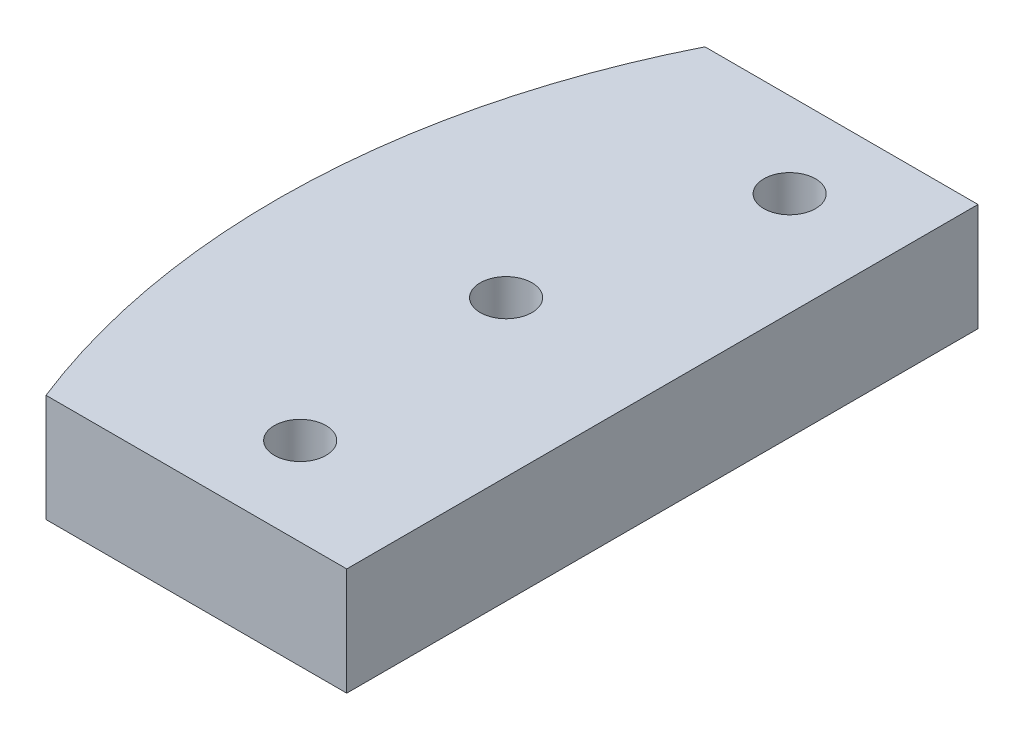
ISO-10303-21;
HEADER;
FILE_DESCRIPTION(('STEP AP214'),'2;1');
FILE_NAME('part.step','',(''),(''),'','','');
FILE_SCHEMA(('AUTOMOTIVE_DESIGN { 1 0 10303 214 1 1 1 1 }'));
ENDSEC;
DATA;
#1=APPLICATION_CONTEXT('core data for automotive mechanical design processes');
#2=APPLICATION_PROTOCOL_DEFINITION('international standard','automotive_design',2000,#1);
#3=PRODUCT_CONTEXT('',#1,'mechanical');
#4=PRODUCT('Part','Part','',(#3));
#5=PRODUCT_RELATED_PRODUCT_CATEGORY('part','',(#4));
#6=PRODUCT_DEFINITION_FORMATION('','',#4);
#7=PRODUCT_DEFINITION_CONTEXT('part definition',#1,'design');
#8=PRODUCT_DEFINITION('design','',#6,#7);
#9=PRODUCT_DEFINITION_SHAPE('','',#8);
#10=(LENGTH_UNIT() NAMED_UNIT(*) SI_UNIT(.MILLI.,.METRE.));
#11=(NAMED_UNIT(*) PLANE_ANGLE_UNIT() SI_UNIT($,.RADIAN.));
#12=(NAMED_UNIT(*) SI_UNIT($,.STERADIAN.) SOLID_ANGLE_UNIT());
#13=UNCERTAINTY_MEASURE_WITH_UNIT(LENGTH_MEASURE(1.E-05),#10,'distance_accuracy_value','');
#14=(GEOMETRIC_REPRESENTATION_CONTEXT(3) GLOBAL_UNCERTAINTY_ASSIGNED_CONTEXT((#13)) GLOBAL_UNIT_ASSIGNED_CONTEXT((#10,
#11,#12)) REPRESENTATION_CONTEXT('',''));
#15=CARTESIAN_POINT('',(0.,0.,0.));
#16=DIRECTION('',(0.,0.,1.));
#17=DIRECTION('',(1.,0.,0.));
#18=AXIS2_PLACEMENT_3D('',#15,#16,#17);
#19=CARTESIAN_POINT('',(-40.2,15.,12.811117837277));
#20=DIRECTION('',(0.,1.,0.));
#21=DIRECTION('',(-1.,0.,0.));
#22=AXIS2_PLACEMENT_3D('',#19,#20,#21);
#23=PLANE('',#22);
#24=CARTESIAN_POINT('',(-78.2,15.,0.100000000000003));
#25=DIRECTION('',(0.,1.,0.));
#26=DIRECTION('',(-1.,0.,0.));
#27=AXIS2_PLACEMENT_3D('',#24,#25,#26);
#28=CIRCLE('',#27,2.49999999999999);
#29=CARTESIAN_POINT('',(-80.7,15.,0.100000000000003));
#30=VERTEX_POINT('',#29);
#31=EDGE_CURVE('E104',#30,#30,#28,.F.);
#32=ORIENTED_EDGE('',*,*,#31,.F.);
#33=EDGE_LOOP('',(#32));
#34=FACE_BOUND('',#33,.T.);
#35=DIRECTION('',(0.,0.,1.));
#36=VECTOR('',#35,1.);
#37=CARTESIAN_POINT('',(-63.2,15.,-33.5));
#38=LINE('',#37,#36);
#39=CARTESIAN_POINT('',(-63.2,15.,-30.5));
#40=VERTEX_POINT('',#39);
#41=CARTESIAN_POINT('',(-63.2,15.,30.5));
#42=VERTEX_POINT('',#41);
#43=EDGE_CURVE('E12',#40,#42,#38,.T.);
#44=ORIENTED_EDGE('',*,*,#43,.T.);
#45=DIRECTION('',(1.,0.,0.));
#46=VECTOR('',#45,1.);
#47=CARTESIAN_POINT('',(0.,15.,30.5));
#48=LINE('',#47,#46);
#49=CARTESIAN_POINT('',(-92.2616921937509,15.,30.5));
#50=VERTEX_POINT('',#49);
#51=EDGE_CURVE('E55',#50,#42,#48,.T.);
#52=ORIENTED_EDGE('',*,*,#51,.F.);
#53=CARTESIAN_POINT('',(-22.6589151875398,15.,2.99288439458776));
#54=DIRECTION('',(0.,1.,0.));
#55=DIRECTION('',(-1.,0.,0.));
#56=AXIS2_PLACEMENT_3D('',#53,#54,#55);
#57=CIRCLE('',#56,74.8410848124602);
#58=CARTESIAN_POINT('',(-89.5873446539231,15.,-30.5));
#59=VERTEX_POINT('',#58);
#60=EDGE_CURVE('E110',#50,#59,#57,.F.);
#61=ORIENTED_EDGE('',*,*,#60,.T.);
#62=DIRECTION('',(1.,0.,0.));
#63=VECTOR('',#62,1.);
#64=CARTESIAN_POINT('',(0.,15.,-30.5));
#65=LINE('',#64,#63);
#66=EDGE_CURVE('E47',#59,#40,#65,.T.);
#67=ORIENTED_EDGE('',*,*,#66,.T.);
#68=EDGE_LOOP('',(#44,#52,#61,#67));
#69=FACE_BOUND('',#68,.T.);
#70=CARTESIAN_POINT('',(-73.2,15.,-22.3));
#71=DIRECTION('',(0.,1.,0.));
#72=DIRECTION('',(-1.,0.,0.));
#73=AXIS2_PLACEMENT_3D('',#70,#71,#72);
#74=CIRCLE('',#73,2.50000000000001);
#75=CARTESIAN_POINT('',(-75.7,15.,-22.3));
#76=VERTEX_POINT('',#75);
#77=EDGE_CURVE('E101',#76,#76,#74,.F.);
#78=ORIENTED_EDGE('',*,*,#77,.F.);
#79=EDGE_LOOP('',(#78));
#80=FACE_BOUND('',#79,.T.);
#81=CARTESIAN_POINT('',(-76.2,15.,22.));
#82=DIRECTION('',(0.,1.,0.));
#83=DIRECTION('',(-1.,0.,0.));
#84=AXIS2_PLACEMENT_3D('',#81,#82,#83);
#85=CIRCLE('',#84,2.50000000000001);
#86=CARTESIAN_POINT('',(-78.7,15.,22.));
#87=VERTEX_POINT('',#86);
#88=EDGE_CURVE('E42',#87,#87,#85,.F.);
#89=ORIENTED_EDGE('',*,*,#88,.F.);
#90=EDGE_LOOP('',(#89));
#91=FACE_BOUND('',#90,.T.);
#92=ADVANCED_FACE('F39',(#34,#69,#80,#91),#23,.F.);
#93=CARTESIAN_POINT('',(-63.2,0.,-33.5));
#94=DIRECTION('',(-1.,0.,0.));
#95=DIRECTION('',(0.,-1.,0.));
#96=AXIS2_PLACEMENT_3D('',#93,#94,#95);
#97=PLANE('',#96);
#98=DIRECTION('',(0.,-1.,0.));
#99=VECTOR('',#98,1.);
#100=CARTESIAN_POINT('',(-63.2,0.,-30.5));
#101=LINE('',#100,#99);
#102=CARTESIAN_POINT('',(-63.2,25.4,-30.5));
#103=VERTEX_POINT('',#102);
#104=EDGE_CURVE('E106',#103,#40,#101,.T.);
#105=ORIENTED_EDGE('',*,*,#104,.F.);
#106=DIRECTION('',(0.,0.,1.));
#107=VECTOR('',#106,1.);
#108=CARTESIAN_POINT('',(-63.2,25.4,-33.5));
#109=LINE('',#108,#107);
#110=CARTESIAN_POINT('',(-63.2,25.4,30.5));
#111=VERTEX_POINT('',#110);
#112=EDGE_CURVE('E96',#103,#111,#109,.T.);
#113=ORIENTED_EDGE('',*,*,#112,.T.);
#114=DIRECTION('',(0.,-1.,0.));
#115=VECTOR('',#114,1.);
#116=CARTESIAN_POINT('',(-63.2,0.,30.5));
#117=LINE('',#116,#115);
#118=EDGE_CURVE('E87',#111,#42,#117,.T.);
#119=ORIENTED_EDGE('',*,*,#118,.T.);
#120=ORIENTED_EDGE('',*,*,#43,.F.);
#121=EDGE_LOOP('',(#105,#113,#119,#120));
#122=FACE_BOUND('',#121,.T.);
#123=ADVANCED_FACE('F122',(#122),#97,.F.);
#124=CARTESIAN_POINT('',(0.,25.4,0.));
#125=DIRECTION('',(0.,-1.,0.));
#126=DIRECTION('',(0.,0.,-1.));
#127=AXIS2_PLACEMENT_3D('',#124,#125,#126);
#128=PLANE('',#127);
#129=CARTESIAN_POINT('',(-73.2,25.4,-22.3));
#130=DIRECTION('',(0.,-1.,0.));
#131=DIRECTION('',(0.,0.,-1.));
#132=AXIS2_PLACEMENT_3D('',#129,#130,#131);
#133=CIRCLE('',#132,2.50000000000001);
#134=CARTESIAN_POINT('',(-73.2,25.4,-24.8));
#135=VERTEX_POINT('',#134);
#136=EDGE_CURVE('E154',#135,#135,#133,.T.);
#137=ORIENTED_EDGE('',*,*,#136,.T.);
#138=EDGE_LOOP('',(#137));
#139=FACE_BOUND('',#138,.T.);
#140=CARTESIAN_POINT('',(-78.2,25.4,0.100000000000003));
#141=DIRECTION('',(0.,-1.,0.));
#142=DIRECTION('',(0.,0.,-1.));
#143=AXIS2_PLACEMENT_3D('',#140,#141,#142);
#144=CIRCLE('',#143,2.49999999999999);
#145=CARTESIAN_POINT('',(-78.2,25.4,-2.39999999999999));
#146=VERTEX_POINT('',#145);
#147=EDGE_CURVE('E158',#146,#146,#144,.T.);
#148=ORIENTED_EDGE('',*,*,#147,.T.);
#149=EDGE_LOOP('',(#148));
#150=FACE_BOUND('',#149,.T.);
#151=CARTESIAN_POINT('',(-76.2,25.4,22.));
#152=DIRECTION('',(0.,-1.,0.));
#153=DIRECTION('',(0.,0.,-1.));
#154=AXIS2_PLACEMENT_3D('',#151,#152,#153);
#155=CIRCLE('',#154,2.50000000000001);
#156=CARTESIAN_POINT('',(-76.2,25.4,19.5));
#157=VERTEX_POINT('',#156);
#158=EDGE_CURVE('E161',#157,#157,#155,.T.);
#159=ORIENTED_EDGE('',*,*,#158,.T.);
#160=EDGE_LOOP('',(#159));
#161=FACE_BOUND('',#160,.T.);
#162=DIRECTION('',(-1.,0.,0.));
#163=VECTOR('',#162,1.);
#164=CARTESIAN_POINT('',(0.,25.4,-30.5));
#165=LINE('',#164,#163);
#166=CARTESIAN_POINT('',(-89.5873446539231,25.4,-30.5));
#167=VERTEX_POINT('',#166);
#168=EDGE_CURVE('E83',#103,#167,#165,.T.);
#169=ORIENTED_EDGE('',*,*,#168,.T.);
#170=CARTESIAN_POINT('',(-22.6589151875398,25.4,2.99288439458776));
#171=DIRECTION('',(0.,-1.,0.));
#172=DIRECTION('',(0.,0.,-1.));
#173=AXIS2_PLACEMENT_3D('',#170,#171,#172);
#174=CIRCLE('',#173,74.8410848124602);
#175=CARTESIAN_POINT('',(-92.2616921937509,25.4,30.5));
#176=VERTEX_POINT('',#175);
#177=EDGE_CURVE('E94',#176,#167,#174,.T.);
#178=ORIENTED_EDGE('',*,*,#177,.F.);
#179=DIRECTION('',(-1.,0.,0.));
#180=VECTOR('',#179,1.);
#181=CARTESIAN_POINT('',(0.,25.4,30.5));
#182=LINE('',#181,#180);
#183=EDGE_CURVE('E162',#111,#176,#182,.T.);
#184=ORIENTED_EDGE('',*,*,#183,.F.);
#185=ORIENTED_EDGE('',*,*,#112,.F.);
#186=EDGE_LOOP('',(#169,#178,#184,#185));
#187=FACE_BOUND('',#186,.T.);
#188=ADVANCED_FACE('F92',(#139,#150,#161,#187),#128,.F.);
#189=CARTESIAN_POINT('',(-73.2,25.4,-22.3));
#190=DIRECTION('',(0.,-1.,0.));
#191=DIRECTION('',(0.,0.,-1.));
#192=AXIS2_PLACEMENT_3D('',#189,#190,#191);
#193=CYLINDRICAL_SURFACE('',#192,2.50000000000001);
#194=ORIENTED_EDGE('',*,*,#77,.T.);
#195=EDGE_LOOP('',(#194));
#196=FACE_BOUND('',#195,.T.);
#197=ORIENTED_EDGE('',*,*,#136,.F.);
#198=EDGE_LOOP('',(#197));
#199=FACE_BOUND('',#198,.T.);
#200=ADVANCED_FACE('F141',(#196,#199),#193,.F.);
#201=CARTESIAN_POINT('',(-78.2,25.4,0.100000000000003));
#202=DIRECTION('',(0.,-1.,0.));
#203=DIRECTION('',(0.,0.,-1.));
#204=AXIS2_PLACEMENT_3D('',#201,#202,#203);
#205=CYLINDRICAL_SURFACE('',#204,2.49999999999999);
#206=ORIENTED_EDGE('',*,*,#31,.T.);
#207=EDGE_LOOP('',(#206));
#208=FACE_BOUND('',#207,.T.);
#209=ORIENTED_EDGE('',*,*,#147,.F.);
#210=EDGE_LOOP('',(#209));
#211=FACE_BOUND('',#210,.T.);
#212=ADVANCED_FACE('F149',(#208,#211),#205,.F.);
#213=CARTESIAN_POINT('',(-76.2,25.4,22.));
#214=DIRECTION('',(0.,-1.,0.));
#215=DIRECTION('',(0.,0.,-1.));
#216=AXIS2_PLACEMENT_3D('',#213,#214,#215);
#217=CYLINDRICAL_SURFACE('',#216,2.50000000000001);
#218=ORIENTED_EDGE('',*,*,#88,.T.);
#219=EDGE_LOOP('',(#218));
#220=FACE_BOUND('',#219,.T.);
#221=ORIENTED_EDGE('',*,*,#158,.F.);
#222=EDGE_LOOP('',(#221));
#223=FACE_BOUND('',#222,.T.);
#224=ADVANCED_FACE('F118',(#220,#223),#217,.F.);
#225=CARTESIAN_POINT('',(-22.6589151875398,25.4,2.99288439458776));
#226=DIRECTION('',(0.,-1.,0.));
#227=DIRECTION('',(0.,0.,-1.));
#228=AXIS2_PLACEMENT_3D('',#225,#226,#227);
#229=CYLINDRICAL_SURFACE('',#228,74.8410848124602);
#230=ORIENTED_EDGE('',*,*,#60,.F.);
#231=DIRECTION('',(0.,1.,0.));
#232=VECTOR('',#231,1.);
#233=CARTESIAN_POINT('',(-92.2616921937509,12.4,30.5));
#234=LINE('',#233,#232);
#235=EDGE_CURVE('E97',#50,#176,#234,.T.);
#236=ORIENTED_EDGE('',*,*,#235,.T.);
#237=ORIENTED_EDGE('',*,*,#177,.T.);
#238=DIRECTION('',(0.,1.,0.));
#239=VECTOR('',#238,1.);
#240=CARTESIAN_POINT('',(-89.5873446539231,12.4,-30.5));
#241=LINE('',#240,#239);
#242=EDGE_CURVE('E79',#59,#167,#241,.T.);
#243=ORIENTED_EDGE('',*,*,#242,.F.);
#244=EDGE_LOOP('',(#230,#236,#237,#243));
#245=FACE_BOUND('',#244,.T.);
#246=ADVANCED_FACE('F99',(#245),#229,.T.);
#247=CARTESIAN_POINT('',(0.,12.4,-30.5));
#248=DIRECTION('',(0.,0.,-1.));
#249=DIRECTION('',(-1.,0.,0.));
#250=AXIS2_PLACEMENT_3D('',#247,#248,#249);
#251=PLANE('',#250);
#252=ORIENTED_EDGE('',*,*,#66,.F.);
#253=ORIENTED_EDGE('',*,*,#242,.T.);
#254=ORIENTED_EDGE('',*,*,#168,.F.);
#255=ORIENTED_EDGE('',*,*,#104,.T.);
#256=EDGE_LOOP('',(#252,#253,#254,#255));
#257=FACE_BOUND('',#256,.T.);
#258=ADVANCED_FACE('F81',(#257),#251,.T.);
#259=CARTESIAN_POINT('',(0.,12.4,30.5));
#260=DIRECTION('',(0.,0.,-1.));
#261=DIRECTION('',(-1.,0.,0.));
#262=AXIS2_PLACEMENT_3D('',#259,#260,#261);
#263=PLANE('',#262);
#264=ORIENTED_EDGE('',*,*,#235,.F.);
#265=ORIENTED_EDGE('',*,*,#51,.T.);
#266=ORIENTED_EDGE('',*,*,#118,.F.);
#267=ORIENTED_EDGE('',*,*,#183,.T.);
#268=EDGE_LOOP('',(#264,#265,#266,#267));
#269=FACE_BOUND('',#268,.T.);
#270=ADVANCED_FACE('F124',(#269),#263,.F.);
#271=CLOSED_SHELL('',(#92,#123,#188,#200,#212,#224,#246,#258,#270));
#272=MANIFOLD_SOLID_BREP('B2',#271);
#273=ADVANCED_BREP_SHAPE_REPRESENTATION('',(#18,#272),#14);
#274=SHAPE_DEFINITION_REPRESENTATION(#9,#273);
ENDSEC;
END-ISO-10303-21;
